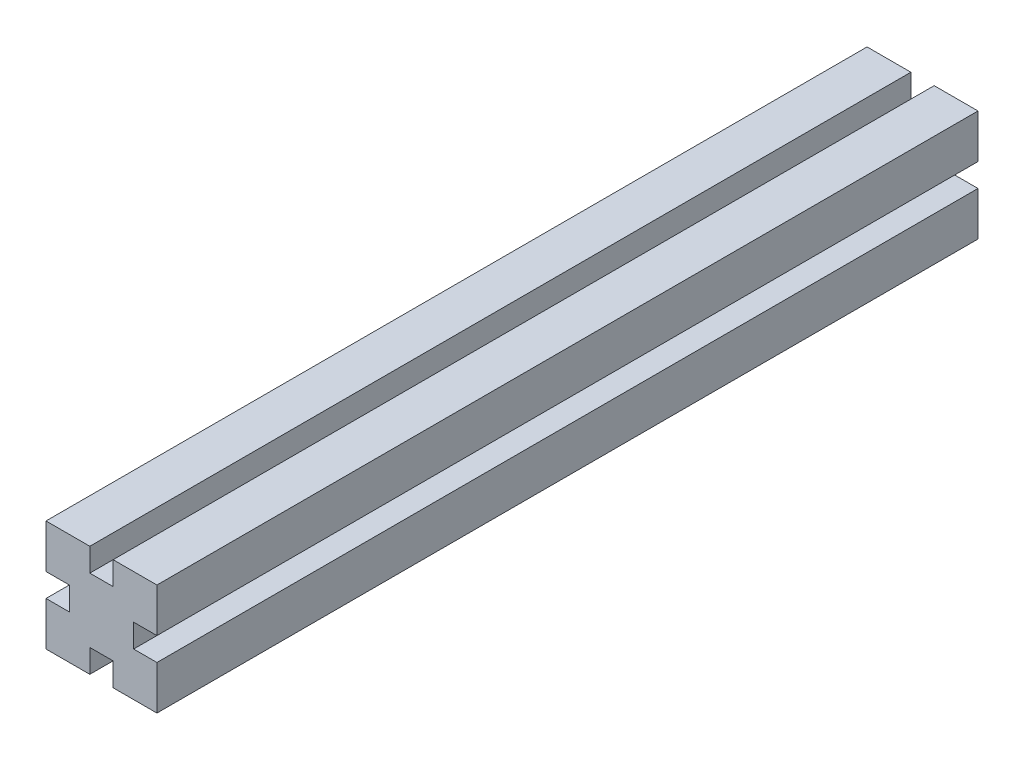
ISO-10303-21;
HEADER;
FILE_DESCRIPTION(('STEP AP214'),'2;1');
FILE_NAME('part.step','',(''),(''),'','','');
FILE_SCHEMA(('AUTOMOTIVE_DESIGN { 1 0 10303 214 1 1 1 1 }'));
ENDSEC;
DATA;
#1=APPLICATION_CONTEXT('core data for automotive mechanical design processes');
#2=APPLICATION_PROTOCOL_DEFINITION('international standard','automotive_design',2000,#1);
#3=PRODUCT_CONTEXT('',#1,'mechanical');
#4=PRODUCT('Part','Part','',(#3));
#5=PRODUCT_RELATED_PRODUCT_CATEGORY('part','',(#4));
#6=PRODUCT_DEFINITION_FORMATION('','',#4);
#7=PRODUCT_DEFINITION_CONTEXT('part definition',#1,'design');
#8=PRODUCT_DEFINITION('design','',#6,#7);
#9=PRODUCT_DEFINITION_SHAPE('','',#8);
#10=(LENGTH_UNIT() NAMED_UNIT(*) SI_UNIT(.MILLI.,.METRE.));
#11=(NAMED_UNIT(*) PLANE_ANGLE_UNIT() SI_UNIT($,.RADIAN.));
#12=(NAMED_UNIT(*) SI_UNIT($,.STERADIAN.) SOLID_ANGLE_UNIT());
#13=UNCERTAINTY_MEASURE_WITH_UNIT(LENGTH_MEASURE(1.E-05),#10,'distance_accuracy_value','');
#14=(GEOMETRIC_REPRESENTATION_CONTEXT(3) GLOBAL_UNCERTAINTY_ASSIGNED_CONTEXT((#13)) GLOBAL_UNIT_ASSIGNED_CONTEXT((#10,
#11,#12)) REPRESENTATION_CONTEXT('',''));
#15=CARTESIAN_POINT('',(0.,0.,0.));
#16=DIRECTION('',(0.,0.,1.));
#17=DIRECTION('',(1.,0.,0.));
#18=AXIS2_PLACEMENT_3D('',#15,#16,#17);
#19=CARTESIAN_POINT('',(-19.05,-4.,282.));
#20=DIRECTION('',(1.,0.,0.));
#21=DIRECTION('',(0.,0.,-1.));
#22=AXIS2_PLACEMENT_3D('',#19,#20,#21);
#23=PLANE('',#22);
#24=DIRECTION('',(0.,-1.,0.));
#25=VECTOR('',#24,1.);
#26=CARTESIAN_POINT('',(-19.05,-4.,0.));
#27=LINE('',#26,#25);
#28=CARTESIAN_POINT('',(-19.05,-4.,0.));
#29=VERTEX_POINT('',#28);
#30=CARTESIAN_POINT('',(-19.05,-19.05,0.));
#31=VERTEX_POINT('',#30);
#32=EDGE_CURVE('E207',#29,#31,#27,.T.);
#33=ORIENTED_EDGE('',*,*,#32,.T.);
#34=DIRECTION('',(0.,0.,-1.));
#35=VECTOR('',#34,1.);
#36=CARTESIAN_POINT('',(-19.05,-19.05,282.));
#37=LINE('',#36,#35);
#38=CARTESIAN_POINT('',(-19.05,-19.05,282.));
#39=VERTEX_POINT('',#38);
#40=EDGE_CURVE('E11',#39,#31,#37,.T.);
#41=ORIENTED_EDGE('',*,*,#40,.F.);
#42=DIRECTION('',(0.,-1.,0.));
#43=VECTOR('',#42,1.);
#44=CARTESIAN_POINT('',(-19.05,-4.,282.));
#45=LINE('',#44,#43);
#46=CARTESIAN_POINT('',(-19.05,-4.,282.));
#47=VERTEX_POINT('',#46);
#48=EDGE_CURVE('E245',#47,#39,#45,.T.);
#49=ORIENTED_EDGE('',*,*,#48,.F.);
#50=DIRECTION('',(0.,0.,-1.));
#51=VECTOR('',#50,1.);
#52=CARTESIAN_POINT('',(-19.05,-4.,282.));
#53=LINE('',#52,#51);
#54=EDGE_CURVE('E203',#47,#29,#53,.T.);
#55=ORIENTED_EDGE('',*,*,#54,.T.);
#56=EDGE_LOOP('',(#33,#41,#49,#55));
#57=FACE_BOUND('',#56,.T.);
#58=ADVANCED_FACE('F39',(#57),#23,.F.);
#59=CARTESIAN_POINT('',(-19.05,-19.05,282.));
#60=DIRECTION('',(0.,1.,0.));
#61=DIRECTION('',(0.,0.,1.));
#62=AXIS2_PLACEMENT_3D('',#59,#60,#61);
#63=PLANE('',#62);
#64=DIRECTION('',(1.,0.,0.));
#65=VECTOR('',#64,1.);
#66=CARTESIAN_POINT('',(-19.05,-19.05,0.));
#67=LINE('',#66,#65);
#68=CARTESIAN_POINT('',(-4.,-19.05,0.));
#69=VERTEX_POINT('',#68);
#70=EDGE_CURVE('E210',#31,#69,#67,.T.);
#71=ORIENTED_EDGE('',*,*,#70,.T.);
#72=DIRECTION('',(0.,0.,-1.));
#73=VECTOR('',#72,1.);
#74=CARTESIAN_POINT('',(-4.,-19.05,282.));
#75=LINE('',#74,#73);
#76=CARTESIAN_POINT('',(-4.,-19.05,282.));
#77=VERTEX_POINT('',#76);
#78=EDGE_CURVE('E47',#77,#69,#75,.T.);
#79=ORIENTED_EDGE('',*,*,#78,.F.);
#80=DIRECTION('',(1.,0.,0.));
#81=VECTOR('',#80,1.);
#82=CARTESIAN_POINT('',(-19.05,-19.05,282.));
#83=LINE('',#82,#81);
#84=EDGE_CURVE('E134',#39,#77,#83,.T.);
#85=ORIENTED_EDGE('',*,*,#84,.F.);
#86=ORIENTED_EDGE('',*,*,#40,.T.);
#87=EDGE_LOOP('',(#71,#79,#85,#86));
#88=FACE_BOUND('',#87,.T.);
#89=ADVANCED_FACE('F363',(#88),#63,.F.);
#90=CARTESIAN_POINT('',(-4.,-19.05,282.));
#91=DIRECTION('',(-1.,0.,0.));
#92=DIRECTION('',(0.,0.,1.));
#93=AXIS2_PLACEMENT_3D('',#90,#91,#92);
#94=PLANE('',#93);
#95=DIRECTION('',(0.,1.,0.));
#96=VECTOR('',#95,1.);
#97=CARTESIAN_POINT('',(-4.,-19.05,0.));
#98=LINE('',#97,#96);
#99=CARTESIAN_POINT('',(-4.,-11.05,0.));
#100=VERTEX_POINT('',#99);
#101=EDGE_CURVE('E212',#69,#100,#98,.T.);
#102=ORIENTED_EDGE('',*,*,#101,.T.);
#103=DIRECTION('',(0.,0.,-1.));
#104=VECTOR('',#103,1.);
#105=CARTESIAN_POINT('',(-4.,-11.05,282.));
#106=LINE('',#105,#104);
#107=CARTESIAN_POINT('',(-4.,-11.05,282.));
#108=VERTEX_POINT('',#107);
#109=EDGE_CURVE('E288',#108,#100,#106,.T.);
#110=ORIENTED_EDGE('',*,*,#109,.F.);
#111=DIRECTION('',(0.,1.,0.));
#112=VECTOR('',#111,1.);
#113=CARTESIAN_POINT('',(-4.,-19.05,282.));
#114=LINE('',#113,#112);
#115=EDGE_CURVE('E296',#77,#108,#114,.T.);
#116=ORIENTED_EDGE('',*,*,#115,.F.);
#117=ORIENTED_EDGE('',*,*,#78,.T.);
#118=EDGE_LOOP('',(#102,#110,#116,#117));
#119=FACE_BOUND('',#118,.T.);
#120=ADVANCED_FACE('F294',(#119),#94,.F.);
#121=CARTESIAN_POINT('',(-4.,-11.05,282.));
#122=DIRECTION('',(0.,1.,0.));
#123=DIRECTION('',(0.,0.,1.));
#124=AXIS2_PLACEMENT_3D('',#121,#122,#123);
#125=PLANE('',#124);
#126=DIRECTION('',(1.,0.,0.));
#127=VECTOR('',#126,1.);
#128=CARTESIAN_POINT('',(-4.,-11.05,0.));
#129=LINE('',#128,#127);
#130=CARTESIAN_POINT('',(4.,-11.05,0.));
#131=VERTEX_POINT('',#130);
#132=EDGE_CURVE('E214',#100,#131,#129,.T.);
#133=ORIENTED_EDGE('',*,*,#132,.T.);
#134=DIRECTION('',(0.,0.,-1.));
#135=VECTOR('',#134,1.);
#136=CARTESIAN_POINT('',(4.,-11.05,282.));
#137=LINE('',#136,#135);
#138=CARTESIAN_POINT('',(4.,-11.05,282.));
#139=VERTEX_POINT('',#138);
#140=EDGE_CURVE('E285',#139,#131,#137,.T.);
#141=ORIENTED_EDGE('',*,*,#140,.F.);
#142=DIRECTION('',(1.,0.,0.));
#143=VECTOR('',#142,1.);
#144=CARTESIAN_POINT('',(-4.,-11.05,282.));
#145=LINE('',#144,#143);
#146=EDGE_CURVE('E314',#108,#139,#145,.T.);
#147=ORIENTED_EDGE('',*,*,#146,.F.);
#148=ORIENTED_EDGE('',*,*,#109,.T.);
#149=EDGE_LOOP('',(#133,#141,#147,#148));
#150=FACE_BOUND('',#149,.T.);
#151=ADVANCED_FACE('F305',(#150),#125,.F.);
#152=CARTESIAN_POINT('',(4.,-11.05,282.));
#153=DIRECTION('',(1.,0.,0.));
#154=DIRECTION('',(0.,0.,-1.));
#155=AXIS2_PLACEMENT_3D('',#152,#153,#154);
#156=PLANE('',#155);
#157=DIRECTION('',(0.,-1.,0.));
#158=VECTOR('',#157,1.);
#159=CARTESIAN_POINT('',(4.,-11.05,0.));
#160=LINE('',#159,#158);
#161=CARTESIAN_POINT('',(4.,-19.05,0.));
#162=VERTEX_POINT('',#161);
#163=EDGE_CURVE('E216',#131,#162,#160,.T.);
#164=ORIENTED_EDGE('',*,*,#163,.T.);
#165=DIRECTION('',(0.,0.,-1.));
#166=VECTOR('',#165,1.);
#167=CARTESIAN_POINT('',(4.,-19.05,282.));
#168=LINE('',#167,#166);
#169=CARTESIAN_POINT('',(4.,-19.05,282.));
#170=VERTEX_POINT('',#169);
#171=EDGE_CURVE('E282',#170,#162,#168,.T.);
#172=ORIENTED_EDGE('',*,*,#171,.F.);
#173=DIRECTION('',(0.,-1.,0.));
#174=VECTOR('',#173,1.);
#175=CARTESIAN_POINT('',(4.,-11.05,282.));
#176=LINE('',#175,#174);
#177=EDGE_CURVE('E311',#139,#170,#176,.T.);
#178=ORIENTED_EDGE('',*,*,#177,.F.);
#179=ORIENTED_EDGE('',*,*,#140,.T.);
#180=EDGE_LOOP('',(#164,#172,#178,#179));
#181=FACE_BOUND('',#180,.T.);
#182=ADVANCED_FACE('F309',(#181),#156,.F.);
#183=CARTESIAN_POINT('',(4.,-19.05,282.));
#184=DIRECTION('',(0.,1.,0.));
#185=DIRECTION('',(0.,0.,1.));
#186=AXIS2_PLACEMENT_3D('',#183,#184,#185);
#187=PLANE('',#186);
#188=DIRECTION('',(1.,0.,0.));
#189=VECTOR('',#188,1.);
#190=CARTESIAN_POINT('',(4.,-19.05,0.));
#191=LINE('',#190,#189);
#192=CARTESIAN_POINT('',(19.05,-19.05,0.));
#193=VERTEX_POINT('',#192);
#194=EDGE_CURVE('E218',#162,#193,#191,.T.);
#195=ORIENTED_EDGE('',*,*,#194,.T.);
#196=DIRECTION('',(0.,0.,-1.));
#197=VECTOR('',#196,1.);
#198=CARTESIAN_POINT('',(19.05,-19.05,282.));
#199=LINE('',#198,#197);
#200=CARTESIAN_POINT('',(19.05,-19.05,282.));
#201=VERTEX_POINT('',#200);
#202=EDGE_CURVE('E279',#201,#193,#199,.T.);
#203=ORIENTED_EDGE('',*,*,#202,.F.);
#204=DIRECTION('',(1.,0.,0.));
#205=VECTOR('',#204,1.);
#206=CARTESIAN_POINT('',(4.,-19.05,282.));
#207=LINE('',#206,#205);
#208=EDGE_CURVE('E313',#170,#201,#207,.T.);
#209=ORIENTED_EDGE('',*,*,#208,.F.);
#210=ORIENTED_EDGE('',*,*,#171,.T.);
#211=EDGE_LOOP('',(#195,#203,#209,#210));
#212=FACE_BOUND('',#211,.T.);
#213=ADVANCED_FACE('F376',(#212),#187,.F.);
#214=CARTESIAN_POINT('',(19.05,-19.05,282.));
#215=DIRECTION('',(-1.,0.,0.));
#216=DIRECTION('',(0.,0.,1.));
#217=AXIS2_PLACEMENT_3D('',#214,#215,#216);
#218=PLANE('',#217);
#219=DIRECTION('',(0.,1.,0.));
#220=VECTOR('',#219,1.);
#221=CARTESIAN_POINT('',(19.05,-19.05,0.));
#222=LINE('',#221,#220);
#223=CARTESIAN_POINT('',(19.05,-4.,0.));
#224=VERTEX_POINT('',#223);
#225=EDGE_CURVE('E220',#193,#224,#222,.T.);
#226=ORIENTED_EDGE('',*,*,#225,.T.);
#227=DIRECTION('',(0.,0.,-1.));
#228=VECTOR('',#227,1.);
#229=CARTESIAN_POINT('',(19.05,-4.,282.));
#230=LINE('',#229,#228);
#231=CARTESIAN_POINT('',(19.05,-4.,282.));
#232=VERTEX_POINT('',#231);
#233=EDGE_CURVE('E276',#232,#224,#230,.T.);
#234=ORIENTED_EDGE('',*,*,#233,.F.);
#235=DIRECTION('',(0.,1.,0.));
#236=VECTOR('',#235,1.);
#237=CARTESIAN_POINT('',(19.05,-19.05,282.));
#238=LINE('',#237,#236);
#239=EDGE_CURVE('E316',#201,#232,#238,.T.);
#240=ORIENTED_EDGE('',*,*,#239,.F.);
#241=ORIENTED_EDGE('',*,*,#202,.T.);
#242=EDGE_LOOP('',(#226,#234,#240,#241));
#243=FACE_BOUND('',#242,.T.);
#244=ADVANCED_FACE('F379',(#243),#218,.F.);
#245=CARTESIAN_POINT('',(19.05,-4.,282.));
#246=DIRECTION('',(0.,-1.,0.));
#247=DIRECTION('',(0.,0.,-1.));
#248=AXIS2_PLACEMENT_3D('',#245,#246,#247);
#249=PLANE('',#248);
#250=DIRECTION('',(-1.,0.,0.));
#251=VECTOR('',#250,1.);
#252=CARTESIAN_POINT('',(19.05,-4.,0.));
#253=LINE('',#252,#251);
#254=CARTESIAN_POINT('',(11.05,-4.,0.));
#255=VERTEX_POINT('',#254);
#256=EDGE_CURVE('E222',#224,#255,#253,.T.);
#257=ORIENTED_EDGE('',*,*,#256,.T.);
#258=DIRECTION('',(0.,0.,-1.));
#259=VECTOR('',#258,1.);
#260=CARTESIAN_POINT('',(11.05,-4.,282.));
#261=LINE('',#260,#259);
#262=CARTESIAN_POINT('',(11.05,-4.,282.));
#263=VERTEX_POINT('',#262);
#264=EDGE_CURVE('E273',#263,#255,#261,.T.);
#265=ORIENTED_EDGE('',*,*,#264,.F.);
#266=DIRECTION('',(-1.,0.,0.));
#267=VECTOR('',#266,1.);
#268=CARTESIAN_POINT('',(19.05,-4.,282.));
#269=LINE('',#268,#267);
#270=EDGE_CURVE('E322',#232,#263,#269,.T.);
#271=ORIENTED_EDGE('',*,*,#270,.F.);
#272=ORIENTED_EDGE('',*,*,#233,.T.);
#273=EDGE_LOOP('',(#257,#265,#271,#272));
#274=FACE_BOUND('',#273,.T.);
#275=ADVANCED_FACE('F383',(#274),#249,.F.);
#276=CARTESIAN_POINT('',(11.05,-4.,282.));
#277=DIRECTION('',(-1.,0.,0.));
#278=DIRECTION('',(0.,0.,1.));
#279=AXIS2_PLACEMENT_3D('',#276,#277,#278);
#280=PLANE('',#279);
#281=DIRECTION('',(0.,1.,0.));
#282=VECTOR('',#281,1.);
#283=CARTESIAN_POINT('',(11.05,-4.,0.));
#284=LINE('',#283,#282);
#285=CARTESIAN_POINT('',(11.05,4.,0.));
#286=VERTEX_POINT('',#285);
#287=EDGE_CURVE('E224',#255,#286,#284,.T.);
#288=ORIENTED_EDGE('',*,*,#287,.T.);
#289=DIRECTION('',(0.,0.,-1.));
#290=VECTOR('',#289,1.);
#291=CARTESIAN_POINT('',(11.05,4.,282.));
#292=LINE('',#291,#290);
#293=CARTESIAN_POINT('',(11.05,4.,282.));
#294=VERTEX_POINT('',#293);
#295=EDGE_CURVE('E270',#294,#286,#292,.T.);
#296=ORIENTED_EDGE('',*,*,#295,.F.);
#297=DIRECTION('',(0.,1.,0.));
#298=VECTOR('',#297,1.);
#299=CARTESIAN_POINT('',(11.05,-4.,282.));
#300=LINE('',#299,#298);
#301=EDGE_CURVE('E324',#263,#294,#300,.T.);
#302=ORIENTED_EDGE('',*,*,#301,.F.);
#303=ORIENTED_EDGE('',*,*,#264,.T.);
#304=EDGE_LOOP('',(#288,#296,#302,#303));
#305=FACE_BOUND('',#304,.T.);
#306=ADVANCED_FACE('F387',(#305),#280,.F.);
#307=CARTESIAN_POINT('',(11.05,4.,282.));
#308=DIRECTION('',(0.,1.,0.));
#309=DIRECTION('',(0.,0.,1.));
#310=AXIS2_PLACEMENT_3D('',#307,#308,#309);
#311=PLANE('',#310);
#312=DIRECTION('',(1.,0.,0.));
#313=VECTOR('',#312,1.);
#314=CARTESIAN_POINT('',(11.05,4.,0.));
#315=LINE('',#314,#313);
#316=CARTESIAN_POINT('',(19.05,4.,0.));
#317=VERTEX_POINT('',#316);
#318=EDGE_CURVE('E226',#286,#317,#315,.T.);
#319=ORIENTED_EDGE('',*,*,#318,.T.);
#320=DIRECTION('',(0.,0.,-1.));
#321=VECTOR('',#320,1.);
#322=CARTESIAN_POINT('',(19.05,4.,282.));
#323=LINE('',#322,#321);
#324=CARTESIAN_POINT('',(19.05,4.,282.));
#325=VERTEX_POINT('',#324);
#326=EDGE_CURVE('E267',#325,#317,#323,.T.);
#327=ORIENTED_EDGE('',*,*,#326,.F.);
#328=DIRECTION('',(1.,0.,0.));
#329=VECTOR('',#328,1.);
#330=CARTESIAN_POINT('',(11.05,4.,282.));
#331=LINE('',#330,#329);
#332=EDGE_CURVE('E326',#294,#325,#331,.T.);
#333=ORIENTED_EDGE('',*,*,#332,.F.);
#334=ORIENTED_EDGE('',*,*,#295,.T.);
#335=EDGE_LOOP('',(#319,#327,#333,#334));
#336=FACE_BOUND('',#335,.T.);
#337=ADVANCED_FACE('F391',(#336),#311,.F.);
#338=CARTESIAN_POINT('',(19.05,4.,282.));
#339=DIRECTION('',(-1.,0.,0.));
#340=DIRECTION('',(0.,0.,1.));
#341=AXIS2_PLACEMENT_3D('',#338,#339,#340);
#342=PLANE('',#341);
#343=DIRECTION('',(0.,1.,0.));
#344=VECTOR('',#343,1.);
#345=CARTESIAN_POINT('',(19.05,4.,0.));
#346=LINE('',#345,#344);
#347=CARTESIAN_POINT('',(19.05,19.05,0.));
#348=VERTEX_POINT('',#347);
#349=EDGE_CURVE('E228',#317,#348,#346,.T.);
#350=ORIENTED_EDGE('',*,*,#349,.T.);
#351=DIRECTION('',(0.,0.,-1.));
#352=VECTOR('',#351,1.);
#353=CARTESIAN_POINT('',(19.05,19.05,282.));
#354=LINE('',#353,#352);
#355=CARTESIAN_POINT('',(19.05,19.05,282.));
#356=VERTEX_POINT('',#355);
#357=EDGE_CURVE('E264',#356,#348,#354,.T.);
#358=ORIENTED_EDGE('',*,*,#357,.F.);
#359=DIRECTION('',(0.,1.,0.));
#360=VECTOR('',#359,1.);
#361=CARTESIAN_POINT('',(19.05,4.,282.));
#362=LINE('',#361,#360);
#363=EDGE_CURVE('E328',#325,#356,#362,.T.);
#364=ORIENTED_EDGE('',*,*,#363,.F.);
#365=ORIENTED_EDGE('',*,*,#326,.T.);
#366=EDGE_LOOP('',(#350,#358,#364,#365));
#367=FACE_BOUND('',#366,.T.);
#368=ADVANCED_FACE('F395',(#367),#342,.F.);
#369=CARTESIAN_POINT('',(19.05,19.05,282.));
#370=DIRECTION('',(0.,-1.,0.));
#371=DIRECTION('',(0.,0.,-1.));
#372=AXIS2_PLACEMENT_3D('',#369,#370,#371);
#373=PLANE('',#372);
#374=DIRECTION('',(-1.,0.,0.));
#375=VECTOR('',#374,1.);
#376=CARTESIAN_POINT('',(19.05,19.05,0.));
#377=LINE('',#376,#375);
#378=CARTESIAN_POINT('',(4.,19.05,0.));
#379=VERTEX_POINT('',#378);
#380=EDGE_CURVE('E230',#348,#379,#377,.T.);
#381=ORIENTED_EDGE('',*,*,#380,.T.);
#382=DIRECTION('',(0.,0.,-1.));
#383=VECTOR('',#382,1.);
#384=CARTESIAN_POINT('',(4.,19.05,282.));
#385=LINE('',#384,#383);
#386=CARTESIAN_POINT('',(4.,19.05,282.));
#387=VERTEX_POINT('',#386);
#388=EDGE_CURVE('E261',#387,#379,#385,.T.);
#389=ORIENTED_EDGE('',*,*,#388,.F.);
#390=DIRECTION('',(-1.,0.,0.));
#391=VECTOR('',#390,1.);
#392=CARTESIAN_POINT('',(19.05,19.05,282.));
#393=LINE('',#392,#391);
#394=EDGE_CURVE('E330',#356,#387,#393,.T.);
#395=ORIENTED_EDGE('',*,*,#394,.F.);
#396=ORIENTED_EDGE('',*,*,#357,.T.);
#397=EDGE_LOOP('',(#381,#389,#395,#396));
#398=FACE_BOUND('',#397,.T.);
#399=ADVANCED_FACE('F399',(#398),#373,.F.);
#400=CARTESIAN_POINT('',(4.,19.05,282.));
#401=DIRECTION('',(1.,0.,0.));
#402=DIRECTION('',(0.,0.,-1.));
#403=AXIS2_PLACEMENT_3D('',#400,#401,#402);
#404=PLANE('',#403);
#405=DIRECTION('',(0.,-1.,0.));
#406=VECTOR('',#405,1.);
#407=CARTESIAN_POINT('',(4.,19.05,0.));
#408=LINE('',#407,#406);
#409=CARTESIAN_POINT('',(4.,11.05,0.));
#410=VERTEX_POINT('',#409);
#411=EDGE_CURVE('E232',#379,#410,#408,.T.);
#412=ORIENTED_EDGE('',*,*,#411,.T.);
#413=DIRECTION('',(0.,0.,-1.));
#414=VECTOR('',#413,1.);
#415=CARTESIAN_POINT('',(4.,11.05,282.));
#416=LINE('',#415,#414);
#417=CARTESIAN_POINT('',(4.,11.05,282.));
#418=VERTEX_POINT('',#417);
#419=EDGE_CURVE('E258',#418,#410,#416,.T.);
#420=ORIENTED_EDGE('',*,*,#419,.F.);
#421=DIRECTION('',(0.,-1.,0.));
#422=VECTOR('',#421,1.);
#423=CARTESIAN_POINT('',(4.,19.05,282.));
#424=LINE('',#423,#422);
#425=EDGE_CURVE('E332',#387,#418,#424,.T.);
#426=ORIENTED_EDGE('',*,*,#425,.F.);
#427=ORIENTED_EDGE('',*,*,#388,.T.);
#428=EDGE_LOOP('',(#412,#420,#426,#427));
#429=FACE_BOUND('',#428,.T.);
#430=ADVANCED_FACE('F403',(#429),#404,.F.);
#431=CARTESIAN_POINT('',(4.,11.05,282.));
#432=DIRECTION('',(0.,-1.,0.));
#433=DIRECTION('',(0.,0.,-1.));
#434=AXIS2_PLACEMENT_3D('',#431,#432,#433);
#435=PLANE('',#434);
#436=DIRECTION('',(-1.,0.,0.));
#437=VECTOR('',#436,1.);
#438=CARTESIAN_POINT('',(4.,11.05,0.));
#439=LINE('',#438,#437);
#440=CARTESIAN_POINT('',(-4.,11.05,0.));
#441=VERTEX_POINT('',#440);
#442=EDGE_CURVE('E234',#410,#441,#439,.T.);
#443=ORIENTED_EDGE('',*,*,#442,.T.);
#444=DIRECTION('',(0.,0.,-1.));
#445=VECTOR('',#444,1.);
#446=CARTESIAN_POINT('',(-4.,11.05,282.));
#447=LINE('',#446,#445);
#448=CARTESIAN_POINT('',(-4.,11.05,282.));
#449=VERTEX_POINT('',#448);
#450=EDGE_CURVE('E255',#449,#441,#447,.T.);
#451=ORIENTED_EDGE('',*,*,#450,.F.);
#452=DIRECTION('',(-1.,0.,0.));
#453=VECTOR('',#452,1.);
#454=CARTESIAN_POINT('',(4.,11.05,282.));
#455=LINE('',#454,#453);
#456=EDGE_CURVE('E334',#418,#449,#455,.T.);
#457=ORIENTED_EDGE('',*,*,#456,.F.);
#458=ORIENTED_EDGE('',*,*,#419,.T.);
#459=EDGE_LOOP('',(#443,#451,#457,#458));
#460=FACE_BOUND('',#459,.T.);
#461=ADVANCED_FACE('F407',(#460),#435,.F.);
#462=CARTESIAN_POINT('',(-4.,11.05,282.));
#463=DIRECTION('',(-1.,0.,0.));
#464=DIRECTION('',(0.,0.,1.));
#465=AXIS2_PLACEMENT_3D('',#462,#463,#464);
#466=PLANE('',#465);
#467=DIRECTION('',(0.,1.,0.));
#468=VECTOR('',#467,1.);
#469=CARTESIAN_POINT('',(-4.,11.05,0.));
#470=LINE('',#469,#468);
#471=CARTESIAN_POINT('',(-4.,19.05,0.));
#472=VERTEX_POINT('',#471);
#473=EDGE_CURVE('E236',#441,#472,#470,.T.);
#474=ORIENTED_EDGE('',*,*,#473,.T.);
#475=DIRECTION('',(0.,0.,-1.));
#476=VECTOR('',#475,1.);
#477=CARTESIAN_POINT('',(-4.,19.05,282.));
#478=LINE('',#477,#476);
#479=CARTESIAN_POINT('',(-4.,19.05,282.));
#480=VERTEX_POINT('',#479);
#481=EDGE_CURVE('E252',#480,#472,#478,.T.);
#482=ORIENTED_EDGE('',*,*,#481,.F.);
#483=DIRECTION('',(0.,1.,0.));
#484=VECTOR('',#483,1.);
#485=CARTESIAN_POINT('',(-4.,11.05,282.));
#486=LINE('',#485,#484);
#487=EDGE_CURVE('E336',#449,#480,#486,.T.);
#488=ORIENTED_EDGE('',*,*,#487,.F.);
#489=ORIENTED_EDGE('',*,*,#450,.T.);
#490=EDGE_LOOP('',(#474,#482,#488,#489));
#491=FACE_BOUND('',#490,.T.);
#492=ADVANCED_FACE('F411',(#491),#466,.F.);
#493=CARTESIAN_POINT('',(-4.,19.05,282.));
#494=DIRECTION('',(0.,-1.,0.));
#495=DIRECTION('',(0.,0.,-1.));
#496=AXIS2_PLACEMENT_3D('',#493,#494,#495);
#497=PLANE('',#496);
#498=DIRECTION('',(-1.,0.,0.));
#499=VECTOR('',#498,1.);
#500=CARTESIAN_POINT('',(-4.,19.05,0.));
#501=LINE('',#500,#499);
#502=CARTESIAN_POINT('',(-19.05,19.05,0.));
#503=VERTEX_POINT('',#502);
#504=EDGE_CURVE('E238',#472,#503,#501,.T.);
#505=ORIENTED_EDGE('',*,*,#504,.T.);
#506=DIRECTION('',(0.,0.,-1.));
#507=VECTOR('',#506,1.);
#508=CARTESIAN_POINT('',(-19.05,19.05,282.));
#509=LINE('',#508,#507);
#510=CARTESIAN_POINT('',(-19.05,19.05,282.));
#511=VERTEX_POINT('',#510);
#512=EDGE_CURVE('E249',#511,#503,#509,.T.);
#513=ORIENTED_EDGE('',*,*,#512,.F.);
#514=DIRECTION('',(-1.,0.,0.));
#515=VECTOR('',#514,1.);
#516=CARTESIAN_POINT('',(-4.,19.05,282.));
#517=LINE('',#516,#515);
#518=EDGE_CURVE('E338',#480,#511,#517,.T.);
#519=ORIENTED_EDGE('',*,*,#518,.F.);
#520=ORIENTED_EDGE('',*,*,#481,.T.);
#521=EDGE_LOOP('',(#505,#513,#519,#520));
#522=FACE_BOUND('',#521,.T.);
#523=ADVANCED_FACE('F344',(#522),#497,.F.);
#524=CARTESIAN_POINT('',(-19.05,19.05,282.));
#525=DIRECTION('',(1.,0.,0.));
#526=DIRECTION('',(0.,0.,-1.));
#527=AXIS2_PLACEMENT_3D('',#524,#525,#526);
#528=PLANE('',#527);
#529=DIRECTION('',(0.,-1.,0.));
#530=VECTOR('',#529,1.);
#531=CARTESIAN_POINT('',(-19.05,19.05,0.));
#532=LINE('',#531,#530);
#533=CARTESIAN_POINT('',(-19.05,4.,0.));
#534=VERTEX_POINT('',#533);
#535=EDGE_CURVE('E240',#503,#534,#532,.T.);
#536=ORIENTED_EDGE('',*,*,#535,.T.);
#537=DIRECTION('',(0.,0.,-1.));
#538=VECTOR('',#537,1.);
#539=CARTESIAN_POINT('',(-19.05,4.,282.));
#540=LINE('',#539,#538);
#541=CARTESIAN_POINT('',(-19.05,4.,282.));
#542=VERTEX_POINT('',#541);
#543=EDGE_CURVE('E198',#542,#534,#540,.T.);
#544=ORIENTED_EDGE('',*,*,#543,.F.);
#545=DIRECTION('',(0.,-1.,0.));
#546=VECTOR('',#545,1.);
#547=CARTESIAN_POINT('',(-19.05,19.05,282.));
#548=LINE('',#547,#546);
#549=EDGE_CURVE('E189',#511,#542,#548,.T.);
#550=ORIENTED_EDGE('',*,*,#549,.F.);
#551=ORIENTED_EDGE('',*,*,#512,.T.);
#552=EDGE_LOOP('',(#536,#544,#550,#551));
#553=FACE_BOUND('',#552,.T.);
#554=ADVANCED_FACE('F348',(#553),#528,.F.);
#555=CARTESIAN_POINT('',(-19.05,4.,282.));
#556=DIRECTION('',(0.,1.,0.));
#557=DIRECTION('',(0.,0.,1.));
#558=AXIS2_PLACEMENT_3D('',#555,#556,#557);
#559=PLANE('',#558);
#560=DIRECTION('',(1.,0.,0.));
#561=VECTOR('',#560,1.);
#562=CARTESIAN_POINT('',(-19.05,4.,0.));
#563=LINE('',#562,#561);
#564=CARTESIAN_POINT('',(-11.05,4.,0.));
#565=VERTEX_POINT('',#564);
#566=EDGE_CURVE('E197',#534,#565,#563,.T.);
#567=ORIENTED_EDGE('',*,*,#566,.T.);
#568=DIRECTION('',(0.,0.,-1.));
#569=VECTOR('',#568,1.);
#570=CARTESIAN_POINT('',(-11.05,4.,282.));
#571=LINE('',#570,#569);
#572=CARTESIAN_POINT('',(-11.05,4.,282.));
#573=VERTEX_POINT('',#572);
#574=EDGE_CURVE('E194',#573,#565,#571,.T.);
#575=ORIENTED_EDGE('',*,*,#574,.F.);
#576=DIRECTION('',(1.,0.,0.));
#577=VECTOR('',#576,1.);
#578=CARTESIAN_POINT('',(-19.05,4.,282.));
#579=LINE('',#578,#577);
#580=EDGE_CURVE('E183',#542,#573,#579,.T.);
#581=ORIENTED_EDGE('',*,*,#580,.F.);
#582=ORIENTED_EDGE('',*,*,#543,.T.);
#583=EDGE_LOOP('',(#567,#575,#581,#582));
#584=FACE_BOUND('',#583,.T.);
#585=ADVANCED_FACE('F195',(#584),#559,.F.);
#586=CARTESIAN_POINT('',(-11.05,4.,282.));
#587=DIRECTION('',(1.,0.,0.));
#588=DIRECTION('',(0.,0.,-1.));
#589=AXIS2_PLACEMENT_3D('',#586,#587,#588);
#590=PLANE('',#589);
#591=DIRECTION('',(0.,-1.,0.));
#592=VECTOR('',#591,1.);
#593=CARTESIAN_POINT('',(-11.05,4.,0.));
#594=LINE('',#593,#592);
#595=CARTESIAN_POINT('',(-11.05,-4.,0.));
#596=VERTEX_POINT('',#595);
#597=EDGE_CURVE('E120',#565,#596,#594,.T.);
#598=ORIENTED_EDGE('',*,*,#597,.T.);
#599=DIRECTION('',(0.,0.,-1.));
#600=VECTOR('',#599,1.);
#601=CARTESIAN_POINT('',(-11.05,-4.,282.));
#602=LINE('',#601,#600);
#603=CARTESIAN_POINT('',(-11.05,-4.,282.));
#604=VERTEX_POINT('',#603);
#605=EDGE_CURVE('E199',#604,#596,#602,.T.);
#606=ORIENTED_EDGE('',*,*,#605,.F.);
#607=DIRECTION('',(0.,-1.,0.));
#608=VECTOR('',#607,1.);
#609=CARTESIAN_POINT('',(-11.05,4.,282.));
#610=LINE('',#609,#608);
#611=EDGE_CURVE('E187',#573,#604,#610,.T.);
#612=ORIENTED_EDGE('',*,*,#611,.F.);
#613=ORIENTED_EDGE('',*,*,#574,.T.);
#614=EDGE_LOOP('',(#598,#606,#612,#613));
#615=FACE_BOUND('',#614,.T.);
#616=ADVANCED_FACE('F201',(#615),#590,.F.);
#617=CARTESIAN_POINT('',(-11.05,-4.,282.));
#618=DIRECTION('',(0.,-1.,0.));
#619=DIRECTION('',(0.,0.,-1.));
#620=AXIS2_PLACEMENT_3D('',#617,#618,#619);
#621=PLANE('',#620);
#622=DIRECTION('',(-1.,0.,0.));
#623=VECTOR('',#622,1.);
#624=CARTESIAN_POINT('',(-11.05,-4.,0.));
#625=LINE('',#624,#623);
#626=EDGE_CURVE('E126',#596,#29,#625,.T.);
#627=ORIENTED_EDGE('',*,*,#626,.T.);
#628=ORIENTED_EDGE('',*,*,#54,.F.);
#629=DIRECTION('',(-1.,0.,0.));
#630=VECTOR('',#629,1.);
#631=CARTESIAN_POINT('',(-11.05,-4.,282.));
#632=LINE('',#631,#630);
#633=EDGE_CURVE('E55',#604,#47,#632,.T.);
#634=ORIENTED_EDGE('',*,*,#633,.F.);
#635=ORIENTED_EDGE('',*,*,#605,.T.);
#636=EDGE_LOOP('',(#627,#628,#634,#635));
#637=FACE_BOUND('',#636,.T.);
#638=ADVANCED_FACE('F352',(#637),#621,.F.);
#639=CARTESIAN_POINT('',(0.,0.,282.));
#640=DIRECTION('',(0.,0.,1.));
#641=DIRECTION('',(1.,0.,0.));
#642=AXIS2_PLACEMENT_3D('',#639,#640,#641);
#643=PLANE('',#642);
#644=ORIENTED_EDGE('',*,*,#48,.T.);
#645=ORIENTED_EDGE('',*,*,#84,.T.);
#646=ORIENTED_EDGE('',*,*,#115,.T.);
#647=ORIENTED_EDGE('',*,*,#146,.T.);
#648=ORIENTED_EDGE('',*,*,#177,.T.);
#649=ORIENTED_EDGE('',*,*,#208,.T.);
#650=ORIENTED_EDGE('',*,*,#239,.T.);
#651=ORIENTED_EDGE('',*,*,#270,.T.);
#652=ORIENTED_EDGE('',*,*,#301,.T.);
#653=ORIENTED_EDGE('',*,*,#332,.T.);
#654=ORIENTED_EDGE('',*,*,#363,.T.);
#655=ORIENTED_EDGE('',*,*,#394,.T.);
#656=ORIENTED_EDGE('',*,*,#425,.T.);
#657=ORIENTED_EDGE('',*,*,#456,.T.);
#658=ORIENTED_EDGE('',*,*,#487,.T.);
#659=ORIENTED_EDGE('',*,*,#518,.T.);
#660=ORIENTED_EDGE('',*,*,#549,.T.);
#661=ORIENTED_EDGE('',*,*,#580,.T.);
#662=ORIENTED_EDGE('',*,*,#611,.T.);
#663=ORIENTED_EDGE('',*,*,#633,.T.);
#664=EDGE_LOOP('',(#644,#645,#646,#647,#648,#649,#650,#651,#652,#653,#654,#655,#656,#657,#658,
#659,#660,#661,#662,#663));
#665=FACE_BOUND('',#664,.T.);
#666=ADVANCED_FACE('F185',(#665),#643,.T.);
#667=CARTESIAN_POINT('',(0.,0.,0.));
#668=DIRECTION('',(0.,0.,1.));
#669=DIRECTION('',(1.,0.,0.));
#670=AXIS2_PLACEMENT_3D('',#667,#668,#669);
#671=PLANE('',#670);
#672=ORIENTED_EDGE('',*,*,#32,.F.);
#673=ORIENTED_EDGE('',*,*,#626,.F.);
#674=ORIENTED_EDGE('',*,*,#597,.F.);
#675=ORIENTED_EDGE('',*,*,#566,.F.);
#676=ORIENTED_EDGE('',*,*,#535,.F.);
#677=ORIENTED_EDGE('',*,*,#504,.F.);
#678=ORIENTED_EDGE('',*,*,#473,.F.);
#679=ORIENTED_EDGE('',*,*,#442,.F.);
#680=ORIENTED_EDGE('',*,*,#411,.F.);
#681=ORIENTED_EDGE('',*,*,#380,.F.);
#682=ORIENTED_EDGE('',*,*,#349,.F.);
#683=ORIENTED_EDGE('',*,*,#318,.F.);
#684=ORIENTED_EDGE('',*,*,#287,.F.);
#685=ORIENTED_EDGE('',*,*,#256,.F.);
#686=ORIENTED_EDGE('',*,*,#225,.F.);
#687=ORIENTED_EDGE('',*,*,#194,.F.);
#688=ORIENTED_EDGE('',*,*,#163,.F.);
#689=ORIENTED_EDGE('',*,*,#132,.F.);
#690=ORIENTED_EDGE('',*,*,#101,.F.);
#691=ORIENTED_EDGE('',*,*,#70,.F.);
#692=EDGE_LOOP('',(#672,#673,#674,#675,#676,#677,#678,#679,#680,#681,#682,#683,#684,#685,#686,
#687,#688,#689,#690,#691));
#693=FACE_BOUND('',#692,.T.);
#694=ADVANCED_FACE('F300',(#693),#671,.F.);
#695=CLOSED_SHELL('',(#58,#89,#120,#151,#182,#213,#244,#275,#306,#337,#368,#399,#430,#461,#492,
#523,#554,#585,#616,#638,#666,#694));
#696=MANIFOLD_SOLID_BREP('B2',#695);
#697=ADVANCED_BREP_SHAPE_REPRESENTATION('',(#18,#696),#14);
#698=SHAPE_DEFINITION_REPRESENTATION(#9,#697);
ENDSEC;
END-ISO-10303-21;
